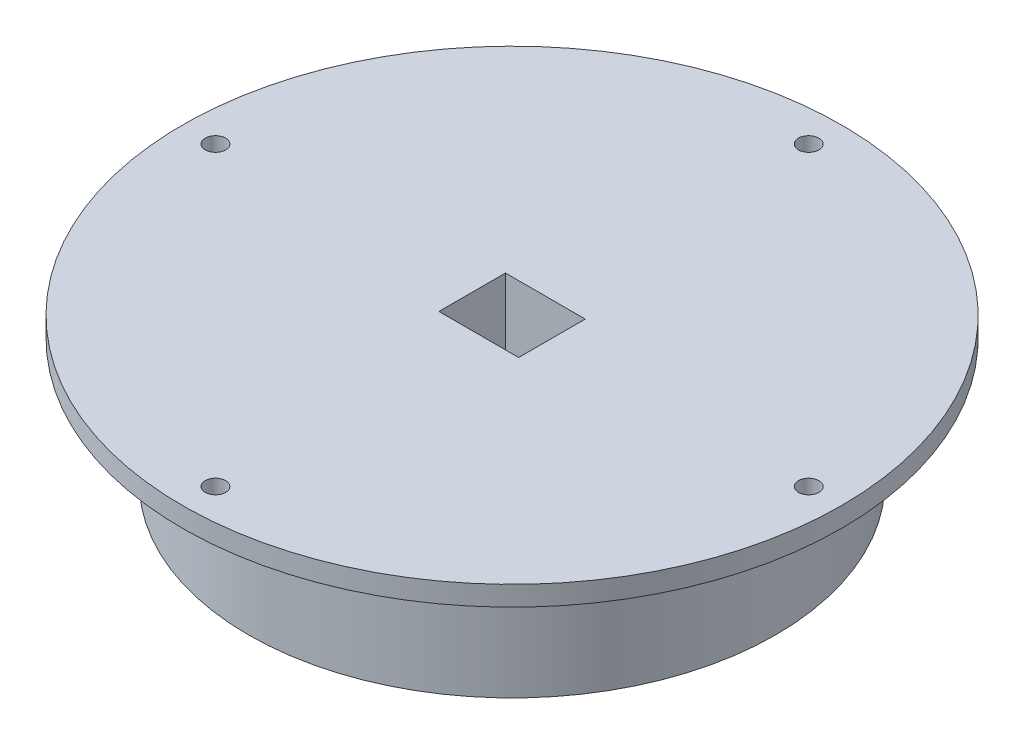
ISO-10303-21;
HEADER;
FILE_DESCRIPTION(('STEP AP214'),'2;1');
FILE_NAME('part.step','',(''),(''),'','','');
FILE_SCHEMA(('AUTOMOTIVE_DESIGN { 1 0 10303 214 1 1 1 1 }'));
ENDSEC;
DATA;
#1=APPLICATION_CONTEXT('core data for automotive mechanical design processes');
#2=APPLICATION_PROTOCOL_DEFINITION('international standard','automotive_design',2000,#1);
#3=PRODUCT_CONTEXT('',#1,'mechanical');
#4=PRODUCT('Part','Part','',(#3));
#5=PRODUCT_RELATED_PRODUCT_CATEGORY('part','',(#4));
#6=PRODUCT_DEFINITION_FORMATION('','',#4);
#7=PRODUCT_DEFINITION_CONTEXT('part definition',#1,'design');
#8=PRODUCT_DEFINITION('design','',#6,#7);
#9=PRODUCT_DEFINITION_SHAPE('','',#8);
#10=(LENGTH_UNIT() NAMED_UNIT(*) SI_UNIT(.MILLI.,.METRE.));
#11=(NAMED_UNIT(*) PLANE_ANGLE_UNIT() SI_UNIT($,.RADIAN.));
#12=(NAMED_UNIT(*) SI_UNIT($,.STERADIAN.) SOLID_ANGLE_UNIT());
#13=UNCERTAINTY_MEASURE_WITH_UNIT(LENGTH_MEASURE(1.E-05),#10,'distance_accuracy_value','');
#14=(GEOMETRIC_REPRESENTATION_CONTEXT(3) GLOBAL_UNCERTAINTY_ASSIGNED_CONTEXT((#13)) GLOBAL_UNIT_ASSIGNED_CONTEXT((#10,
#11,#12)) REPRESENTATION_CONTEXT('',''));
#15=CARTESIAN_POINT('',(0.,0.,0.));
#16=DIRECTION('',(0.,0.,1.));
#17=DIRECTION('',(1.,0.,0.));
#18=AXIS2_PLACEMENT_3D('',#15,#16,#17);
#19=CARTESIAN_POINT('',(40.,22.,0.));
#20=DIRECTION('',(0.,1.,0.));
#21=DIRECTION('',(-1.,0.,0.));
#22=AXIS2_PLACEMENT_3D('',#19,#20,#21);
#23=PLANE('',#22);
#24=CARTESIAN_POINT('',(45.,22.,0.));
#25=DIRECTION('',(0.,1.,0.));
#26=DIRECTION('',(-1.,0.,0.));
#27=AXIS2_PLACEMENT_3D('',#24,#25,#26);
#28=CIRCLE('',#27,1.55);
#29=CARTESIAN_POINT('',(43.45,22.,0.));
#30=VERTEX_POINT('',#29);
#31=EDGE_CURVE('E150',#30,#30,#28,.T.);
#32=ORIENTED_EDGE('',*,*,#31,.F.);
#33=EDGE_LOOP('',(#32));
#34=FACE_BOUND('',#33,.T.);
#35=CARTESIAN_POINT('',(-45.,22.,0.));
#36=DIRECTION('',(0.,1.,0.));
#37=DIRECTION('',(1.,0.,0.));
#38=AXIS2_PLACEMENT_3D('',#35,#36,#37);
#39=CIRCLE('',#38,1.55);
#40=CARTESIAN_POINT('',(-43.45,22.,0.));
#41=VERTEX_POINT('',#40);
#42=EDGE_CURVE('E208',#41,#41,#39,.T.);
#43=ORIENTED_EDGE('',*,*,#42,.F.);
#44=EDGE_LOOP('',(#43));
#45=FACE_BOUND('',#44,.T.);
#46=CARTESIAN_POINT('',(0.,22.,-45.));
#47=DIRECTION('',(0.,1.,0.));
#48=DIRECTION('',(-1.,0.,0.));
#49=AXIS2_PLACEMENT_3D('',#46,#47,#48);
#50=CIRCLE('',#49,1.55);
#51=CARTESIAN_POINT('',(-1.55000000000001,22.,-45.));
#52=VERTEX_POINT('',#51);
#53=EDGE_CURVE('E212',#52,#52,#50,.T.);
#54=ORIENTED_EDGE('',*,*,#53,.F.);
#55=EDGE_LOOP('',(#54));
#56=FACE_BOUND('',#55,.T.);
#57=CARTESIAN_POINT('',(0.,22.,45.));
#58=DIRECTION('',(0.,1.,0.));
#59=DIRECTION('',(1.,0.,0.));
#60=AXIS2_PLACEMENT_3D('',#57,#58,#59);
#61=CIRCLE('',#60,1.55);
#62=CARTESIAN_POINT('',(1.55,22.,45.));
#63=VERTEX_POINT('',#62);
#64=EDGE_CURVE('E216',#63,#63,#61,.T.);
#65=ORIENTED_EDGE('',*,*,#64,.F.);
#66=EDGE_LOOP('',(#65));
#67=FACE_BOUND('',#66,.T.);
#68=DIRECTION('',(0.,0.,1.));
#69=VECTOR('',#68,1.);
#70=CARTESIAN_POINT('',(-6.05000000000001,22.,-5.05));
#71=LINE('',#70,#69);
#72=CARTESIAN_POINT('',(-6.05000000000001,22.,-5.05));
#73=VERTEX_POINT('',#72);
#74=CARTESIAN_POINT('',(-6.05000000000001,22.,5.05));
#75=VERTEX_POINT('',#74);
#76=EDGE_CURVE('E57',#73,#75,#71,.T.);
#77=ORIENTED_EDGE('',*,*,#76,.F.);
#78=DIRECTION('',(-1.,0.,0.));
#79=VECTOR('',#78,1.);
#80=CARTESIAN_POINT('',(-6.05000000000001,22.,-5.05));
#81=LINE('',#80,#79);
#82=CARTESIAN_POINT('',(6.04999999999999,22.,-5.05));
#83=VERTEX_POINT('',#82);
#84=EDGE_CURVE('E112',#83,#73,#81,.T.);
#85=ORIENTED_EDGE('',*,*,#84,.F.);
#86=DIRECTION('',(0.,0.,-1.));
#87=VECTOR('',#86,1.);
#88=CARTESIAN_POINT('',(6.04999999999999,22.,-5.05));
#89=LINE('',#88,#87);
#90=CARTESIAN_POINT('',(6.04999999999999,22.,5.05));
#91=VERTEX_POINT('',#90);
#92=EDGE_CURVE('E123',#91,#83,#89,.T.);
#93=ORIENTED_EDGE('',*,*,#92,.F.);
#94=DIRECTION('',(1.,0.,0.));
#95=VECTOR('',#94,1.);
#96=CARTESIAN_POINT('',(-6.05000000000001,22.,5.05));
#97=LINE('',#96,#95);
#98=EDGE_CURVE('E92',#75,#91,#97,.T.);
#99=ORIENTED_EDGE('',*,*,#98,.F.);
#100=EDGE_LOOP('',(#77,#85,#93,#99));
#101=FACE_BOUND('',#100,.T.);
#102=CARTESIAN_POINT('',(0.,22.,0.));
#103=DIRECTION('',(0.,-1.,0.));
#104=DIRECTION('',(1.,0.,0.));
#105=AXIS2_PLACEMENT_3D('',#102,#103,#104);
#106=CIRCLE('',#105,50.);
#107=CARTESIAN_POINT('',(50.,22.,0.));
#108=VERTEX_POINT('',#107);
#109=EDGE_CURVE('E11',#108,#108,#106,.T.);
#110=ORIENTED_EDGE('',*,*,#109,.F.);
#111=EDGE_LOOP('',(#110));
#112=FACE_BOUND('',#111,.T.);
#113=ADVANCED_FACE('F40',(#34,#45,#56,#67,#101,#112),#23,.T.);
#114=CARTESIAN_POINT('',(0.,0.,0.));
#115=DIRECTION('',(0.,-1.,0.));
#116=DIRECTION('',(1.,0.,0.));
#117=AXIS2_PLACEMENT_3D('',#114,#115,#116);
#118=CYLINDRICAL_SURFACE('',#117,50.);
#119=ORIENTED_EDGE('',*,*,#109,.T.);
#120=EDGE_LOOP('',(#119));
#121=FACE_BOUND('',#120,.T.);
#122=CARTESIAN_POINT('',(0.,19.,0.));
#123=DIRECTION('',(0.,-1.,0.));
#124=DIRECTION('',(1.,0.,0.));
#125=AXIS2_PLACEMENT_3D('',#122,#123,#124);
#126=CIRCLE('',#125,50.);
#127=CARTESIAN_POINT('',(50.,19.,0.));
#128=VERTEX_POINT('',#127);
#129=EDGE_CURVE('E49',#128,#128,#126,.T.);
#130=ORIENTED_EDGE('',*,*,#129,.F.);
#131=EDGE_LOOP('',(#130));
#132=FACE_BOUND('',#131,.T.);
#133=ADVANCED_FACE('F168',(#121,#132),#118,.T.);
#134=CARTESIAN_POINT('',(40.,19.,0.));
#135=DIRECTION('',(0.,-1.,0.));
#136=DIRECTION('',(1.,0.,0.));
#137=AXIS2_PLACEMENT_3D('',#134,#135,#136);
#138=PLANE('',#137);
#139=CARTESIAN_POINT('',(45.,19.,0.));
#140=DIRECTION('',(0.,-1.,0.));
#141=DIRECTION('',(1.,0.,0.));
#142=AXIS2_PLACEMENT_3D('',#139,#140,#141);
#143=CIRCLE('',#142,1.55);
#144=CARTESIAN_POINT('',(46.55,19.,0.));
#145=VERTEX_POINT('',#144);
#146=EDGE_CURVE('E120',#145,#145,#143,.T.);
#147=ORIENTED_EDGE('',*,*,#146,.F.);
#148=EDGE_LOOP('',(#147));
#149=FACE_BOUND('',#148,.T.);
#150=CARTESIAN_POINT('',(-45.,19.,0.));
#151=DIRECTION('',(0.,-1.,0.));
#152=DIRECTION('',(1.,0.,0.));
#153=AXIS2_PLACEMENT_3D('',#150,#151,#152);
#154=CIRCLE('',#153,1.55);
#155=CARTESIAN_POINT('',(-43.45,19.,0.));
#156=VERTEX_POINT('',#155);
#157=EDGE_CURVE('E154',#156,#156,#154,.T.);
#158=ORIENTED_EDGE('',*,*,#157,.F.);
#159=EDGE_LOOP('',(#158));
#160=FACE_BOUND('',#159,.T.);
#161=CARTESIAN_POINT('',(0.,19.,-45.));
#162=DIRECTION('',(0.,-1.,0.));
#163=DIRECTION('',(1.,0.,0.));
#164=AXIS2_PLACEMENT_3D('',#161,#162,#163);
#165=CIRCLE('',#164,1.55);
#166=CARTESIAN_POINT('',(1.55,19.,-45.));
#167=VERTEX_POINT('',#166);
#168=EDGE_CURVE('E149',#167,#167,#165,.T.);
#169=ORIENTED_EDGE('',*,*,#168,.F.);
#170=EDGE_LOOP('',(#169));
#171=FACE_BOUND('',#170,.T.);
#172=CARTESIAN_POINT('',(0.,19.,45.));
#173=DIRECTION('',(0.,-1.,0.));
#174=DIRECTION('',(1.,0.,0.));
#175=AXIS2_PLACEMENT_3D('',#172,#173,#174);
#176=CIRCLE('',#175,1.55);
#177=CARTESIAN_POINT('',(1.55,19.,45.));
#178=VERTEX_POINT('',#177);
#179=EDGE_CURVE('E145',#178,#178,#176,.T.);
#180=ORIENTED_EDGE('',*,*,#179,.F.);
#181=EDGE_LOOP('',(#180));
#182=FACE_BOUND('',#181,.T.);
#183=ORIENTED_EDGE('',*,*,#129,.T.);
#184=EDGE_LOOP('',(#183));
#185=FACE_BOUND('',#184,.T.);
#186=CARTESIAN_POINT('',(0.,19.,0.));
#187=DIRECTION('',(0.,-1.,0.));
#188=DIRECTION('',(1.,0.,0.));
#189=AXIS2_PLACEMENT_3D('',#186,#187,#188);
#190=CIRCLE('',#189,40.);
#191=CARTESIAN_POINT('',(40.,19.,0.));
#192=VERTEX_POINT('',#191);
#193=EDGE_CURVE('E138',#192,#192,#190,.T.);
#194=ORIENTED_EDGE('',*,*,#193,.F.);
#195=EDGE_LOOP('',(#194));
#196=FACE_BOUND('',#195,.T.);
#197=ADVANCED_FACE('F164',(#149,#160,#171,#182,#185,#196),#138,.T.);
#198=CARTESIAN_POINT('',(0.,0.,0.));
#199=DIRECTION('',(0.,-1.,0.));
#200=DIRECTION('',(1.,0.,0.));
#201=AXIS2_PLACEMENT_3D('',#198,#199,#200);
#202=CYLINDRICAL_SURFACE('',#201,40.);
#203=ORIENTED_EDGE('',*,*,#193,.T.);
#204=EDGE_LOOP('',(#203));
#205=FACE_BOUND('',#204,.T.);
#206=CARTESIAN_POINT('',(0.,0.,0.));
#207=DIRECTION('',(0.,-1.,0.));
#208=DIRECTION('',(1.,0.,0.));
#209=AXIS2_PLACEMENT_3D('',#206,#207,#208);
#210=CIRCLE('',#209,40.);
#211=CARTESIAN_POINT('',(40.,0.,0.));
#212=VERTEX_POINT('',#211);
#213=EDGE_CURVE('E130',#212,#212,#210,.T.);
#214=ORIENTED_EDGE('',*,*,#213,.F.);
#215=EDGE_LOOP('',(#214));
#216=FACE_BOUND('',#215,.T.);
#217=ADVANCED_FACE('F167',(#205,#216),#202,.T.);
#218=CARTESIAN_POINT('',(0.,0.,0.));
#219=DIRECTION('',(0.,-1.,0.));
#220=DIRECTION('',(1.,0.,0.));
#221=AXIS2_PLACEMENT_3D('',#218,#219,#220);
#222=PLANE('',#221);
#223=CARTESIAN_POINT('',(0.,0.,0.));
#224=DIRECTION('',(0.,-1.,0.));
#225=DIRECTION('',(1.,0.,0.));
#226=AXIS2_PLACEMENT_3D('',#223,#224,#225);
#227=CIRCLE('',#226,4.25);
#228=CARTESIAN_POINT('',(4.25,0.,0.));
#229=VERTEX_POINT('',#228);
#230=EDGE_CURVE('E43',#229,#229,#227,.T.);
#231=ORIENTED_EDGE('',*,*,#230,.F.);
#232=EDGE_LOOP('',(#231));
#233=FACE_BOUND('',#232,.T.);
#234=ORIENTED_EDGE('',*,*,#213,.T.);
#235=EDGE_LOOP('',(#234));
#236=FACE_BOUND('',#235,.T.);
#237=ADVANCED_FACE('F182',(#233,#236),#222,.T.);
#238=CARTESIAN_POINT('',(-6.05,0.699999999999982,-5.05));
#239=DIRECTION('',(-1.,0.,0.));
#240=DIRECTION('',(0.,-1.,0.));
#241=AXIS2_PLACEMENT_3D('',#238,#239,#240);
#242=PLANE('',#241);
#243=ORIENTED_EDGE('',*,*,#76,.T.);
#244=DIRECTION('',(0.,1.,0.));
#245=VECTOR('',#244,1.);
#246=CARTESIAN_POINT('',(-6.05,0.699999999999982,5.05));
#247=LINE('',#246,#245);
#248=CARTESIAN_POINT('',(-6.05,0.699999999999982,5.05));
#249=VERTEX_POINT('',#248);
#250=EDGE_CURVE('E80',#249,#75,#247,.T.);
#251=ORIENTED_EDGE('',*,*,#250,.F.);
#252=DIRECTION('',(0.,0.,1.));
#253=VECTOR('',#252,1.);
#254=CARTESIAN_POINT('',(-6.05,0.699999999999982,-5.05));
#255=LINE('',#254,#253);
#256=CARTESIAN_POINT('',(-6.05,0.699999999999982,-5.05));
#257=VERTEX_POINT('',#256);
#258=EDGE_CURVE('E108',#257,#249,#255,.T.);
#259=ORIENTED_EDGE('',*,*,#258,.F.);
#260=DIRECTION('',(0.,1.,0.));
#261=VECTOR('',#260,1.);
#262=CARTESIAN_POINT('',(-6.05,0.699999999999982,-5.05));
#263=LINE('',#262,#261);
#264=EDGE_CURVE('E65',#257,#73,#263,.T.);
#265=ORIENTED_EDGE('',*,*,#264,.T.);
#266=EDGE_LOOP('',(#243,#251,#259,#265));
#267=FACE_BOUND('',#266,.T.);
#268=ADVANCED_FACE('F187',(#267),#242,.F.);
#269=CARTESIAN_POINT('',(-6.05,0.699999999999982,-5.05));
#270=DIRECTION('',(0.,0.,-1.));
#271=DIRECTION('',(-1.,0.,0.));
#272=AXIS2_PLACEMENT_3D('',#269,#270,#271);
#273=PLANE('',#272);
#274=ORIENTED_EDGE('',*,*,#84,.T.);
#275=ORIENTED_EDGE('',*,*,#264,.F.);
#276=DIRECTION('',(-1.,0.,0.));
#277=VECTOR('',#276,1.);
#278=CARTESIAN_POINT('',(-6.05,0.699999999999982,-5.05));
#279=LINE('',#278,#277);
#280=CARTESIAN_POINT('',(6.05,0.699999999999989,-5.05));
#281=VERTEX_POINT('',#280);
#282=EDGE_CURVE('E105',#281,#257,#279,.T.);
#283=ORIENTED_EDGE('',*,*,#282,.F.);
#284=DIRECTION('',(0.,1.,0.));
#285=VECTOR('',#284,1.);
#286=CARTESIAN_POINT('',(6.05,0.699999999999989,-5.05));
#287=LINE('',#286,#285);
#288=EDGE_CURVE('E97',#281,#83,#287,.T.);
#289=ORIENTED_EDGE('',*,*,#288,.T.);
#290=EDGE_LOOP('',(#274,#275,#283,#289));
#291=FACE_BOUND('',#290,.T.);
#292=ADVANCED_FACE('F193',(#291),#273,.F.);
#293=CARTESIAN_POINT('',(6.05,0.699999999999989,-5.05));
#294=DIRECTION('',(1.,0.,0.));
#295=DIRECTION('',(0.,1.,0.));
#296=AXIS2_PLACEMENT_3D('',#293,#294,#295);
#297=PLANE('',#296);
#298=ORIENTED_EDGE('',*,*,#92,.T.);
#299=ORIENTED_EDGE('',*,*,#288,.F.);
#300=DIRECTION('',(0.,0.,-1.));
#301=VECTOR('',#300,1.);
#302=CARTESIAN_POINT('',(6.05,0.699999999999989,-5.05));
#303=LINE('',#302,#301);
#304=CARTESIAN_POINT('',(6.05,0.699999999999989,5.05));
#305=VERTEX_POINT('',#304);
#306=EDGE_CURVE('E100',#305,#281,#303,.T.);
#307=ORIENTED_EDGE('',*,*,#306,.F.);
#308=DIRECTION('',(0.,1.,0.));
#309=VECTOR('',#308,1.);
#310=CARTESIAN_POINT('',(6.05,0.699999999999989,5.05));
#311=LINE('',#310,#309);
#312=EDGE_CURVE('E85',#305,#91,#311,.T.);
#313=ORIENTED_EDGE('',*,*,#312,.T.);
#314=EDGE_LOOP('',(#298,#299,#307,#313));
#315=FACE_BOUND('',#314,.T.);
#316=ADVANCED_FACE('F101',(#315),#297,.F.);
#317=CARTESIAN_POINT('',(-6.05,0.699999999999982,5.05));
#318=DIRECTION('',(0.,0.,1.));
#319=DIRECTION('',(1.,0.,0.));
#320=AXIS2_PLACEMENT_3D('',#317,#318,#319);
#321=PLANE('',#320);
#322=ORIENTED_EDGE('',*,*,#98,.T.);
#323=ORIENTED_EDGE('',*,*,#312,.F.);
#324=DIRECTION('',(1.,0.,0.));
#325=VECTOR('',#324,1.);
#326=CARTESIAN_POINT('',(-6.05,0.699999999999982,5.05));
#327=LINE('',#326,#325);
#328=EDGE_CURVE('E89',#249,#305,#327,.T.);
#329=ORIENTED_EDGE('',*,*,#328,.F.);
#330=ORIENTED_EDGE('',*,*,#250,.T.);
#331=EDGE_LOOP('',(#322,#323,#329,#330));
#332=FACE_BOUND('',#331,.T.);
#333=ADVANCED_FACE('F87',(#332),#321,.F.);
#334=CARTESIAN_POINT('',(0.,0.699999999999985,0.));
#335=DIRECTION('',(0.,1.,0.));
#336=DIRECTION('',(-1.,0.,0.));
#337=AXIS2_PLACEMENT_3D('',#334,#335,#336);
#338=PLANE('',#337);
#339=CARTESIAN_POINT('',(0.,0.699999999999985,0.));
#340=DIRECTION('',(0.,1.,0.));
#341=DIRECTION('',(-1.,0.,0.));
#342=AXIS2_PLACEMENT_3D('',#339,#340,#341);
#343=CIRCLE('',#342,4.25);
#344=CARTESIAN_POINT('',(-4.25,0.699999999999983,0.));
#345=VERTEX_POINT('',#344);
#346=EDGE_CURVE('E243',#345,#345,#343,.T.);
#347=ORIENTED_EDGE('',*,*,#346,.F.);
#348=EDGE_LOOP('',(#347));
#349=FACE_BOUND('',#348,.T.);
#350=ORIENTED_EDGE('',*,*,#258,.T.);
#351=ORIENTED_EDGE('',*,*,#328,.T.);
#352=ORIENTED_EDGE('',*,*,#306,.T.);
#353=ORIENTED_EDGE('',*,*,#282,.T.);
#354=EDGE_LOOP('',(#350,#351,#352,#353));
#355=FACE_BOUND('',#354,.T.);
#356=ADVANCED_FACE('F107',(#349,#355),#338,.T.);
#357=CARTESIAN_POINT('',(0.,0.699999999999985,45.));
#358=DIRECTION('',(0.,1.,0.));
#359=DIRECTION('',(-1.,0.,0.));
#360=AXIS2_PLACEMENT_3D('',#357,#358,#359);
#361=CYLINDRICAL_SURFACE('',#360,1.55);
#362=ORIENTED_EDGE('',*,*,#179,.T.);
#363=EDGE_LOOP('',(#362));
#364=FACE_BOUND('',#363,.T.);
#365=ORIENTED_EDGE('',*,*,#64,.T.);
#366=EDGE_LOOP('',(#365));
#367=FACE_BOUND('',#366,.T.);
#368=ADVANCED_FACE('F234',(#364,#367),#361,.F.);
#369=CARTESIAN_POINT('',(0.,0.699999999999985,-45.));
#370=DIRECTION('',(0.,1.,0.));
#371=DIRECTION('',(-1.,0.,0.));
#372=AXIS2_PLACEMENT_3D('',#369,#370,#371);
#373=CYLINDRICAL_SURFACE('',#372,1.55);
#374=ORIENTED_EDGE('',*,*,#168,.T.);
#375=EDGE_LOOP('',(#374));
#376=FACE_BOUND('',#375,.T.);
#377=ORIENTED_EDGE('',*,*,#53,.T.);
#378=EDGE_LOOP('',(#377));
#379=FACE_BOUND('',#378,.T.);
#380=ADVANCED_FACE('F239',(#376,#379),#373,.F.);
#381=CARTESIAN_POINT('',(-45.,0.699999999999972,0.));
#382=DIRECTION('',(0.,1.,0.));
#383=DIRECTION('',(-1.,0.,0.));
#384=AXIS2_PLACEMENT_3D('',#381,#382,#383);
#385=CYLINDRICAL_SURFACE('',#384,1.55);
#386=ORIENTED_EDGE('',*,*,#157,.T.);
#387=EDGE_LOOP('',(#386));
#388=FACE_BOUND('',#387,.T.);
#389=ORIENTED_EDGE('',*,*,#42,.T.);
#390=EDGE_LOOP('',(#389));
#391=FACE_BOUND('',#390,.T.);
#392=ADVANCED_FACE('F259',(#388,#391),#385,.F.);
#393=CARTESIAN_POINT('',(45.,0.699999999999999,0.));
#394=DIRECTION('',(0.,1.,0.));
#395=DIRECTION('',(-1.,0.,0.));
#396=AXIS2_PLACEMENT_3D('',#393,#394,#395);
#397=CYLINDRICAL_SURFACE('',#396,1.55);
#398=ORIENTED_EDGE('',*,*,#146,.T.);
#399=EDGE_LOOP('',(#398));
#400=FACE_BOUND('',#399,.T.);
#401=ORIENTED_EDGE('',*,*,#31,.T.);
#402=EDGE_LOOP('',(#401));
#403=FACE_BOUND('',#402,.T.);
#404=ADVANCED_FACE('F161',(#400,#403),#397,.F.);
#405=CARTESIAN_POINT('',(0.,-20.6,0.));
#406=DIRECTION('',(0.,1.,0.));
#407=DIRECTION('',(-1.,0.,0.));
#408=AXIS2_PLACEMENT_3D('',#405,#406,#407);
#409=CYLINDRICAL_SURFACE('',#408,4.25);
#410=ORIENTED_EDGE('',*,*,#230,.T.);
#411=EDGE_LOOP('',(#410));
#412=FACE_BOUND('',#411,.T.);
#413=ORIENTED_EDGE('',*,*,#346,.T.);
#414=EDGE_LOOP('',(#413));
#415=FACE_BOUND('',#414,.T.);
#416=ADVANCED_FACE('F270',(#412,#415),#409,.F.);
#417=CLOSED_SHELL('',(#113,#133,#197,#217,#237,#268,#292,#316,#333,#356,#368,#380,#392,#404,#416));
#418=MANIFOLD_SOLID_BREP('B2',#417);
#419=ADVANCED_BREP_SHAPE_REPRESENTATION('',(#18,#418),#14);
#420=SHAPE_DEFINITION_REPRESENTATION(#9,#419);
ENDSEC;
END-ISO-10303-21;
